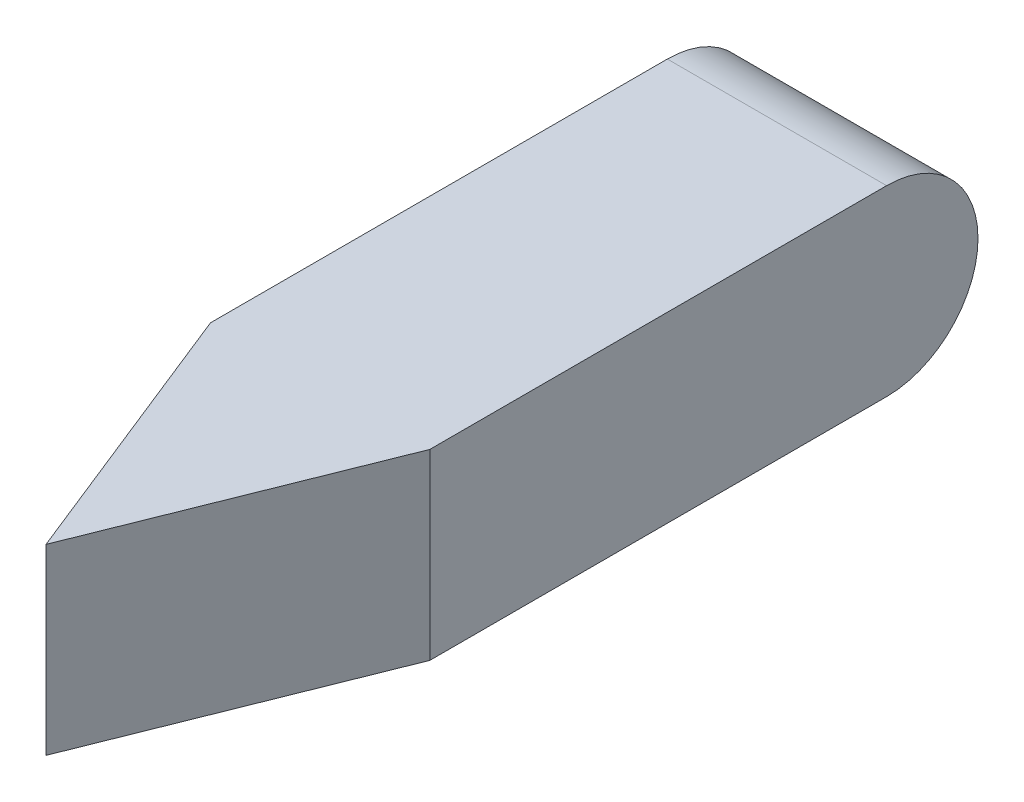
ISO-10303-21;
HEADER;
FILE_DESCRIPTION(('STEP AP214'),'2;1');
FILE_NAME('part.step','',(''),(''),'','','');
FILE_SCHEMA(('AUTOMOTIVE_DESIGN { 1 0 10303 214 1 1 1 1 }'));
ENDSEC;
DATA;
#1=APPLICATION_CONTEXT('core data for automotive mechanical design processes');
#2=APPLICATION_PROTOCOL_DEFINITION('international standard','automotive_design',2000,#1);
#3=PRODUCT_CONTEXT('',#1,'mechanical');
#4=PRODUCT('Part','Part','',(#3));
#5=PRODUCT_RELATED_PRODUCT_CATEGORY('part','',(#4));
#6=PRODUCT_DEFINITION_FORMATION('','',#4);
#7=PRODUCT_DEFINITION_CONTEXT('part definition',#1,'design');
#8=PRODUCT_DEFINITION('design','',#6,#7);
#9=PRODUCT_DEFINITION_SHAPE('','',#8);
#10=(LENGTH_UNIT() NAMED_UNIT(*) SI_UNIT(.MILLI.,.METRE.));
#11=(NAMED_UNIT(*) PLANE_ANGLE_UNIT() SI_UNIT($,.RADIAN.));
#12=(NAMED_UNIT(*) SI_UNIT($,.STERADIAN.) SOLID_ANGLE_UNIT());
#13=UNCERTAINTY_MEASURE_WITH_UNIT(LENGTH_MEASURE(1.E-05),#10,'distance_accuracy_value','');
#14=(GEOMETRIC_REPRESENTATION_CONTEXT(3) GLOBAL_UNCERTAINTY_ASSIGNED_CONTEXT((#13)) GLOBAL_UNIT_ASSIGNED_CONTEXT((#10,
#11,#12)) REPRESENTATION_CONTEXT('',''));
#15=CARTESIAN_POINT('',(0.,0.,0.));
#16=DIRECTION('',(0.,0.,1.));
#17=DIRECTION('',(1.,0.,0.));
#18=AXIS2_PLACEMENT_3D('',#15,#16,#17);
#19=CARTESIAN_POINT('',(12.,0.,45.));
#20=DIRECTION('',(-1.,0.,0.));
#21=DIRECTION('',(0.,0.,1.));
#22=AXIS2_PLACEMENT_3D('',#19,#20,#21);
#23=PLANE('',#22);
#24=DIRECTION('',(0.,-1.,0.));
#25=VECTOR('',#24,1.);
#26=CARTESIAN_POINT('',(12.,65.,30.));
#27=LINE('',#26,#25);
#28=CARTESIAN_POINT('',(12.,10.,30.));
#29=VERTEX_POINT('',#28);
#30=CARTESIAN_POINT('',(12.,0.,30.));
#31=VERTEX_POINT('',#30);
#32=EDGE_CURVE('E112',#29,#31,#27,.T.);
#33=ORIENTED_EDGE('',*,*,#32,.T.);
#34=DIRECTION('',(0.,0.,-1.));
#35=VECTOR('',#34,1.);
#36=CARTESIAN_POINT('',(12.,0.,45.));
#37=LINE('',#36,#35);
#38=CARTESIAN_POINT('',(12.,0.,5.));
#39=VERTEX_POINT('',#38);
#40=EDGE_CURVE('E84',#31,#39,#37,.T.);
#41=ORIENTED_EDGE('',*,*,#40,.T.);
#42=CARTESIAN_POINT('',(12.,5.,5.));
#43=DIRECTION('',(1.,0.,0.));
#44=DIRECTION('',(0.,0.,-1.));
#45=AXIS2_PLACEMENT_3D('',#42,#43,#44);
#46=CIRCLE('',#45,5.);
#47=CARTESIAN_POINT('',(12.,10.,5.));
#48=VERTEX_POINT('',#47);
#49=EDGE_CURVE('E140',#39,#48,#46,.T.);
#50=ORIENTED_EDGE('',*,*,#49,.T.);
#51=DIRECTION('',(0.,0.,-1.));
#52=VECTOR('',#51,1.);
#53=CARTESIAN_POINT('',(12.,10.,45.));
#54=LINE('',#53,#52);
#55=EDGE_CURVE('E119',#29,#48,#54,.T.);
#56=ORIENTED_EDGE('',*,*,#55,.F.);
#57=EDGE_LOOP('',(#33,#41,#50,#56));
#58=FACE_BOUND('',#57,.T.);
#59=ADVANCED_FACE('F61',(#58),#23,.F.);
#60=CARTESIAN_POINT('',(0.,10.,45.));
#61=DIRECTION('',(0.,-1.,0.));
#62=DIRECTION('',(0.,0.,-1.));
#63=AXIS2_PLACEMENT_3D('',#60,#61,#62);
#64=PLANE('',#63);
#65=DIRECTION('',(-0.371390676354104,0.,0.928476690885259));
#66=VECTOR('',#65,1.);
#67=CARTESIAN_POINT('',(5.17241379310345,10.,47.0689655172414));
#68=LINE('',#67,#66);
#69=CARTESIAN_POINT('',(6.,10.,45.));
#70=VERTEX_POINT('',#69);
#71=EDGE_CURVE('E121',#29,#70,#68,.T.);
#72=ORIENTED_EDGE('',*,*,#71,.F.);
#73=ORIENTED_EDGE('',*,*,#55,.T.);
#74=DIRECTION('',(1.,0.,0.));
#75=VECTOR('',#74,1.);
#76=CARTESIAN_POINT('',(-53.,10.,5.));
#77=LINE('',#76,#75);
#78=CARTESIAN_POINT('',(0.,10.,5.));
#79=VERTEX_POINT('',#78);
#80=EDGE_CURVE('E143',#79,#48,#77,.T.);
#81=ORIENTED_EDGE('',*,*,#80,.F.);
#82=DIRECTION('',(0.,0.,-1.));
#83=VECTOR('',#82,1.);
#84=CARTESIAN_POINT('',(0.,10.,45.));
#85=LINE('',#84,#83);
#86=CARTESIAN_POINT('',(0.,10.,30.));
#87=VERTEX_POINT('',#86);
#88=EDGE_CURVE('E129',#87,#79,#85,.T.);
#89=ORIENTED_EDGE('',*,*,#88,.F.);
#90=DIRECTION('',(0.371390676354104,0.,0.928476690885259));
#91=VECTOR('',#90,1.);
#92=CARTESIAN_POINT('',(5.17241379310345,10.,42.9310344827586));
#93=LINE('',#92,#91);
#94=EDGE_CURVE('E147',#87,#70,#93,.T.);
#95=ORIENTED_EDGE('',*,*,#94,.T.);
#96=EDGE_LOOP('',(#72,#73,#81,#89,#95));
#97=FACE_BOUND('',#96,.T.);
#98=ADVANCED_FACE('F163',(#97),#64,.F.);
#99=CARTESIAN_POINT('',(0.,0.,45.));
#100=DIRECTION('',(0.,1.,0.));
#101=DIRECTION('',(0.,0.,1.));
#102=AXIS2_PLACEMENT_3D('',#99,#100,#101);
#103=PLANE('',#102);
#104=DIRECTION('',(-0.371390676354104,0.,0.928476690885259));
#105=VECTOR('',#104,1.);
#106=CARTESIAN_POINT('',(20.6896551724138,0.,8.27586206896552));
#107=LINE('',#106,#105);
#108=CARTESIAN_POINT('',(6.,0.,45.));
#109=VERTEX_POINT('',#108);
#110=EDGE_CURVE('E110',#31,#109,#107,.T.);
#111=ORIENTED_EDGE('',*,*,#110,.T.);
#112=DIRECTION('',(0.371390676354104,0.,0.928476690885259));
#113=VECTOR('',#112,1.);
#114=CARTESIAN_POINT('',(-10.3448275862069,0.,4.13793103448276));
#115=LINE('',#114,#113);
#116=CARTESIAN_POINT('',(0.,0.,30.));
#117=VERTEX_POINT('',#116);
#118=EDGE_CURVE('E154',#117,#109,#115,.T.);
#119=ORIENTED_EDGE('',*,*,#118,.F.);
#120=DIRECTION('',(0.,0.,-1.));
#121=VECTOR('',#120,1.);
#122=CARTESIAN_POINT('',(0.,0.,45.));
#123=LINE('',#122,#121);
#124=CARTESIAN_POINT('',(0.,0.,5.));
#125=VERTEX_POINT('',#124);
#126=EDGE_CURVE('E70',#117,#125,#123,.T.);
#127=ORIENTED_EDGE('',*,*,#126,.T.);
#128=DIRECTION('',(1.,0.,0.));
#129=VECTOR('',#128,1.);
#130=CARTESIAN_POINT('',(-53.,0.,5.));
#131=LINE('',#130,#129);
#132=EDGE_CURVE('E124',#125,#39,#131,.T.);
#133=ORIENTED_EDGE('',*,*,#132,.T.);
#134=ORIENTED_EDGE('',*,*,#40,.F.);
#135=EDGE_LOOP('',(#111,#119,#127,#133,#134));
#136=FACE_BOUND('',#135,.T.);
#137=ADVANCED_FACE('F123',(#136),#103,.F.);
#138=CARTESIAN_POINT('',(0.,0.,45.));
#139=DIRECTION('',(1.,0.,0.));
#140=DIRECTION('',(0.,0.,-1.));
#141=AXIS2_PLACEMENT_3D('',#138,#139,#140);
#142=PLANE('',#141);
#143=ORIENTED_EDGE('',*,*,#126,.F.);
#144=DIRECTION('',(0.,-1.,0.));
#145=VECTOR('',#144,1.);
#146=CARTESIAN_POINT('',(0.,65.,30.));
#147=LINE('',#146,#145);
#148=EDGE_CURVE('E151',#87,#117,#147,.T.);
#149=ORIENTED_EDGE('',*,*,#148,.F.);
#150=ORIENTED_EDGE('',*,*,#88,.T.);
#151=CARTESIAN_POINT('',(0.,5.,5.));
#152=DIRECTION('',(1.,0.,0.));
#153=DIRECTION('',(0.,0.,-1.));
#154=AXIS2_PLACEMENT_3D('',#151,#152,#153);
#155=CIRCLE('',#154,5.);
#156=EDGE_CURVE('E134',#125,#79,#155,.T.);
#157=ORIENTED_EDGE('',*,*,#156,.F.);
#158=EDGE_LOOP('',(#143,#149,#150,#157));
#159=FACE_BOUND('',#158,.T.);
#160=ADVANCED_FACE('F63',(#159),#142,.F.);
#161=CARTESIAN_POINT('',(-53.,5.,5.));
#162=DIRECTION('',(1.,0.,0.));
#163=DIRECTION('',(0.,0.,-1.));
#164=AXIS2_PLACEMENT_3D('',#161,#162,#163);
#165=CYLINDRICAL_SURFACE('',#164,5.);
#166=ORIENTED_EDGE('',*,*,#156,.T.);
#167=ORIENTED_EDGE('',*,*,#80,.T.);
#168=ORIENTED_EDGE('',*,*,#49,.F.);
#169=ORIENTED_EDGE('',*,*,#132,.F.);
#170=EDGE_LOOP('',(#166,#167,#168,#169));
#171=FACE_BOUND('',#170,.T.);
#172=ADVANCED_FACE('F168',(#171),#165,.T.);
#173=CARTESIAN_POINT('',(-10.3448275862069,65.,4.13793103448276));
#174=DIRECTION('',(0.928476690885259,0.,-0.371390676354104));
#175=DIRECTION('',(-0.371390676354104,0.,-0.928476690885259));
#176=AXIS2_PLACEMENT_3D('',#173,#174,#175);
#177=PLANE('',#176);
#178=ORIENTED_EDGE('',*,*,#148,.T.);
#179=ORIENTED_EDGE('',*,*,#118,.T.);
#180=DIRECTION('',(0.,-1.,0.));
#181=VECTOR('',#180,1.);
#182=CARTESIAN_POINT('',(6.,0.,45.));
#183=LINE('',#182,#181);
#184=EDGE_CURVE('E12',#70,#109,#183,.T.);
#185=ORIENTED_EDGE('',*,*,#184,.F.);
#186=ORIENTED_EDGE('',*,*,#94,.F.);
#187=EDGE_LOOP('',(#178,#179,#185,#186));
#188=FACE_BOUND('',#187,.T.);
#189=ADVANCED_FACE('F160',(#188),#177,.F.);
#190=CARTESIAN_POINT('',(20.6896551724138,65.,8.27586206896552));
#191=DIRECTION('',(0.928476690885259,0.,0.371390676354104));
#192=DIRECTION('',(0.371390676354104,0.,-0.928476690885259));
#193=AXIS2_PLACEMENT_3D('',#190,#191,#192);
#194=PLANE('',#193);
#195=ORIENTED_EDGE('',*,*,#71,.T.);
#196=ORIENTED_EDGE('',*,*,#184,.T.);
#197=ORIENTED_EDGE('',*,*,#110,.F.);
#198=ORIENTED_EDGE('',*,*,#32,.F.);
#199=EDGE_LOOP('',(#195,#196,#197,#198));
#200=FACE_BOUND('',#199,.T.);
#201=ADVANCED_FACE('F111',(#200),#194,.T.);
#202=CLOSED_SHELL('',(#59,#98,#137,#160,#172,#189,#201));
#203=MANIFOLD_SOLID_BREP('B2',#202);
#204=ADVANCED_BREP_SHAPE_REPRESENTATION('',(#18,#203),#14);
#205=SHAPE_DEFINITION_REPRESENTATION(#9,#204);
ENDSEC;
END-ISO-10303-21;
